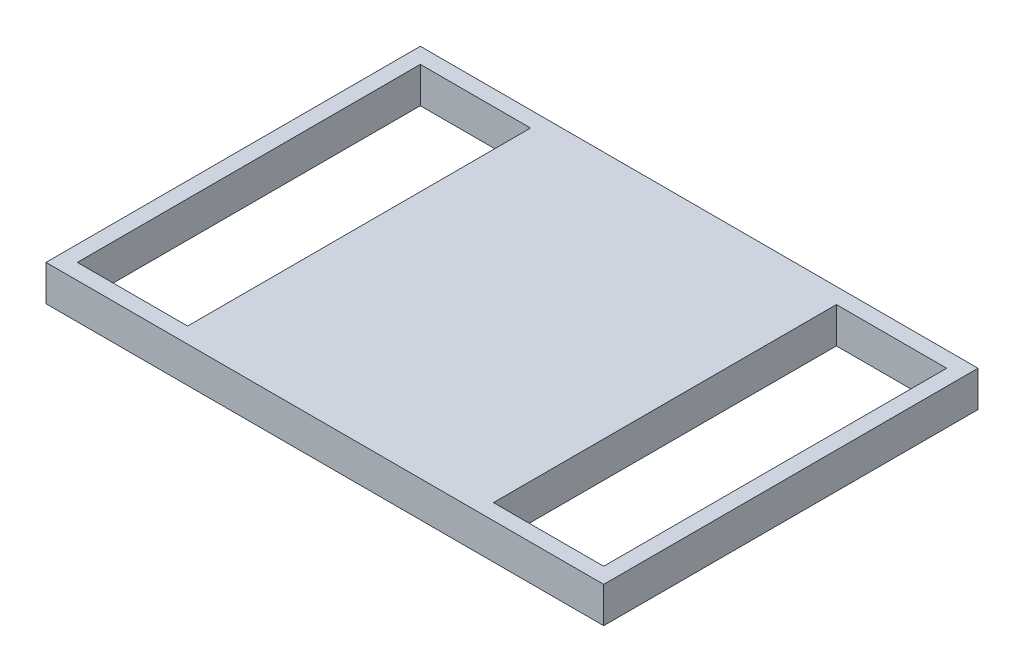
ISO-10303-21;
HEADER;
FILE_DESCRIPTION(('STEP AP214'),'2;1');
FILE_NAME('part.step','',(''),(''),'','','');
FILE_SCHEMA(('AUTOMOTIVE_DESIGN { 1 0 10303 214 1 1 1 1 }'));
ENDSEC;
DATA;
#1=APPLICATION_CONTEXT('core data for automotive mechanical design processes');
#2=APPLICATION_PROTOCOL_DEFINITION('international standard','automotive_design',2000,#1);
#3=PRODUCT_CONTEXT('',#1,'mechanical');
#4=PRODUCT('Part','Part','',(#3));
#5=PRODUCT_RELATED_PRODUCT_CATEGORY('part','',(#4));
#6=PRODUCT_DEFINITION_FORMATION('','',#4);
#7=PRODUCT_DEFINITION_CONTEXT('part definition',#1,'design');
#8=PRODUCT_DEFINITION('design','',#6,#7);
#9=PRODUCT_DEFINITION_SHAPE('','',#8);
#10=(LENGTH_UNIT() NAMED_UNIT(*) SI_UNIT(.MILLI.,.METRE.));
#11=(NAMED_UNIT(*) PLANE_ANGLE_UNIT() SI_UNIT($,.RADIAN.));
#12=(NAMED_UNIT(*) SI_UNIT($,.STERADIAN.) SOLID_ANGLE_UNIT());
#13=UNCERTAINTY_MEASURE_WITH_UNIT(LENGTH_MEASURE(1.E-05),#10,'distance_accuracy_value','');
#14=(GEOMETRIC_REPRESENTATION_CONTEXT(3) GLOBAL_UNCERTAINTY_ASSIGNED_CONTEXT((#13)) GLOBAL_UNIT_ASSIGNED_CONTEXT((#10,
#11,#12)) REPRESENTATION_CONTEXT('',''));
#15=CARTESIAN_POINT('',(0.,0.,0.));
#16=DIRECTION('',(0.,0.,1.));
#17=DIRECTION('',(1.,0.,0.));
#18=AXIS2_PLACEMENT_3D('',#15,#16,#17);
#19=CARTESIAN_POINT('',(0.,25.4,0.));
#20=DIRECTION('',(0.,1.,0.));
#21=DIRECTION('',(0.,0.,1.));
#22=AXIS2_PLACEMENT_3D('',#19,#20,#21);
#23=PLANE('',#22);
#24=DIRECTION('',(0.,0.,-1.));
#25=VECTOR('',#24,1.);
#26=CARTESIAN_POINT('',(197.7,25.4,132.7));
#27=LINE('',#26,#25);
#28=CARTESIAN_POINT('',(197.7,25.4,132.7));
#29=VERTEX_POINT('',#28);
#30=CARTESIAN_POINT('',(197.7,25.4,-132.7));
#31=VERTEX_POINT('',#30);
#32=EDGE_CURVE('E221',#29,#31,#27,.T.);
#33=ORIENTED_EDGE('',*,*,#32,.T.);
#34=DIRECTION('',(-1.,0.,0.));
#35=VECTOR('',#34,1.);
#36=CARTESIAN_POINT('',(197.7,25.4,-132.7));
#37=LINE('',#36,#35);
#38=CARTESIAN_POINT('',(-197.7,25.4,-132.7));
#39=VERTEX_POINT('',#38);
#40=EDGE_CURVE('E225',#31,#39,#37,.T.);
#41=ORIENTED_EDGE('',*,*,#40,.T.);
#42=DIRECTION('',(0.,0.,1.));
#43=VECTOR('',#42,1.);
#44=CARTESIAN_POINT('',(-197.7,25.4,132.7));
#45=LINE('',#44,#43);
#46=CARTESIAN_POINT('',(-197.7,25.4,132.7));
#47=VERTEX_POINT('',#46);
#48=EDGE_CURVE('E229',#39,#47,#45,.T.);
#49=ORIENTED_EDGE('',*,*,#48,.T.);
#50=DIRECTION('',(1.,0.,0.));
#51=VECTOR('',#50,1.);
#52=CARTESIAN_POINT('',(197.7,25.4,132.7));
#53=LINE('',#52,#51);
#54=EDGE_CURVE('E232',#47,#29,#53,.T.);
#55=ORIENTED_EDGE('',*,*,#54,.T.);
#56=EDGE_LOOP('',(#33,#41,#49,#55));
#57=FACE_BOUND('',#56,.T.);
#58=DIRECTION('',(0.,0.,1.));
#59=VECTOR('',#58,1.);
#60=CARTESIAN_POINT('',(-186.5875,25.4,0.));
#61=LINE('',#60,#59);
#62=CARTESIAN_POINT('',(-186.5875,25.4,-121.5875));
#63=VERTEX_POINT('',#62);
#64=CARTESIAN_POINT('',(-186.5875,25.4,121.5875));
#65=VERTEX_POINT('',#64);
#66=EDGE_CURVE('E200',#63,#65,#61,.T.);
#67=ORIENTED_EDGE('',*,*,#66,.F.);
#68=DIRECTION('',(1.,0.,0.));
#69=VECTOR('',#68,1.);
#70=CARTESIAN_POINT('',(0.,25.4,-121.5875));
#71=LINE('',#70,#69);
#72=CARTESIAN_POINT('',(-108.4125,25.4,-121.5875));
#73=VERTEX_POINT('',#72);
#74=EDGE_CURVE('E63',#63,#73,#71,.T.);
#75=ORIENTED_EDGE('',*,*,#74,.T.);
#76=DIRECTION('',(0.,0.,1.));
#77=VECTOR('',#76,1.);
#78=CARTESIAN_POINT('',(-108.4125,25.4,0.));
#79=LINE('',#78,#77);
#80=CARTESIAN_POINT('',(-108.4125,25.4,121.5875));
#81=VERTEX_POINT('',#80);
#82=EDGE_CURVE('E186',#73,#81,#79,.T.);
#83=ORIENTED_EDGE('',*,*,#82,.T.);
#84=DIRECTION('',(1.,0.,0.));
#85=VECTOR('',#84,1.);
#86=CARTESIAN_POINT('',(0.,25.4,121.5875));
#87=LINE('',#86,#85);
#88=EDGE_CURVE('E204',#65,#81,#87,.T.);
#89=ORIENTED_EDGE('',*,*,#88,.F.);
#90=EDGE_LOOP('',(#67,#75,#83,#89));
#91=FACE_BOUND('',#90,.T.);
#92=DIRECTION('',(0.,0.,1.));
#93=VECTOR('',#92,1.);
#94=CARTESIAN_POINT('',(108.4125,25.4,0.));
#95=LINE('',#94,#93);
#96=CARTESIAN_POINT('',(108.4125,25.4,-121.5875));
#97=VERTEX_POINT('',#96);
#98=CARTESIAN_POINT('',(108.4125,25.4,121.5875));
#99=VERTEX_POINT('',#98);
#100=EDGE_CURVE('E166',#97,#99,#95,.T.);
#101=ORIENTED_EDGE('',*,*,#100,.F.);
#102=DIRECTION('',(1.,0.,0.));
#103=VECTOR('',#102,1.);
#104=CARTESIAN_POINT('',(0.,25.4,-121.5875));
#105=LINE('',#104,#103);
#106=CARTESIAN_POINT('',(186.5875,25.4,-121.5875));
#107=VERTEX_POINT('',#106);
#108=EDGE_CURVE('E55',#97,#107,#105,.T.);
#109=ORIENTED_EDGE('',*,*,#108,.T.);
#110=DIRECTION('',(0.,0.,1.));
#111=VECTOR('',#110,1.);
#112=CARTESIAN_POINT('',(186.5875,25.4,0.));
#113=LINE('',#112,#111);
#114=CARTESIAN_POINT('',(186.5875,25.4,121.5875));
#115=VERTEX_POINT('',#114);
#116=EDGE_CURVE('E153',#107,#115,#113,.T.);
#117=ORIENTED_EDGE('',*,*,#116,.T.);
#118=DIRECTION('',(1.,0.,0.));
#119=VECTOR('',#118,1.);
#120=CARTESIAN_POINT('',(0.,25.4,121.5875));
#121=LINE('',#120,#119);
#122=EDGE_CURVE('E157',#99,#115,#121,.T.);
#123=ORIENTED_EDGE('',*,*,#122,.F.);
#124=EDGE_LOOP('',(#101,#109,#117,#123));
#125=FACE_BOUND('',#124,.T.);
#126=ADVANCED_FACE('F39',(#57,#91,#125),#23,.T.);
#127=CARTESIAN_POINT('',(0.,0.,0.));
#128=DIRECTION('',(0.,1.,0.));
#129=DIRECTION('',(0.,0.,1.));
#130=AXIS2_PLACEMENT_3D('',#127,#128,#129);
#131=PLANE('',#130);
#132=DIRECTION('',(1.,0.,0.));
#133=VECTOR('',#132,1.);
#134=CARTESIAN_POINT('',(0.,0.,-121.5875));
#135=LINE('',#134,#133);
#136=CARTESIAN_POINT('',(-186.5875,0.,-121.5875));
#137=VERTEX_POINT('',#136);
#138=CARTESIAN_POINT('',(-108.4125,0.,-121.5875));
#139=VERTEX_POINT('',#138);
#140=EDGE_CURVE('E182',#137,#139,#135,.T.);
#141=ORIENTED_EDGE('',*,*,#140,.F.);
#142=DIRECTION('',(0.,0.,1.));
#143=VECTOR('',#142,1.);
#144=CARTESIAN_POINT('',(-186.5875,0.,0.));
#145=LINE('',#144,#143);
#146=CARTESIAN_POINT('',(-186.5875,0.,121.5875));
#147=VERTEX_POINT('',#146);
#148=EDGE_CURVE('E185',#137,#147,#145,.T.);
#149=ORIENTED_EDGE('',*,*,#148,.T.);
#150=DIRECTION('',(1.,0.,0.));
#151=VECTOR('',#150,1.);
#152=CARTESIAN_POINT('',(0.,0.,121.5875));
#153=LINE('',#152,#151);
#154=CARTESIAN_POINT('',(-108.4125,0.,121.5875));
#155=VERTEX_POINT('',#154);
#156=EDGE_CURVE('E190',#147,#155,#153,.T.);
#157=ORIENTED_EDGE('',*,*,#156,.T.);
#158=DIRECTION('',(0.,0.,1.));
#159=VECTOR('',#158,1.);
#160=CARTESIAN_POINT('',(-108.4125,0.,0.));
#161=LINE('',#160,#159);
#162=EDGE_CURVE('E194',#139,#155,#161,.T.);
#163=ORIENTED_EDGE('',*,*,#162,.F.);
#164=EDGE_LOOP('',(#141,#149,#157,#163));
#165=FACE_BOUND('',#164,.T.);
#166=DIRECTION('',(0.,0.,-1.));
#167=VECTOR('',#166,1.);
#168=CARTESIAN_POINT('',(197.7,0.,132.7));
#169=LINE('',#168,#167);
#170=CARTESIAN_POINT('',(197.7,0.,132.7));
#171=VERTEX_POINT('',#170);
#172=CARTESIAN_POINT('',(197.7,0.,-132.7));
#173=VERTEX_POINT('',#172);
#174=EDGE_CURVE('E176',#171,#173,#169,.T.);
#175=ORIENTED_EDGE('',*,*,#174,.F.);
#176=DIRECTION('',(1.,0.,0.));
#177=VECTOR('',#176,1.);
#178=CARTESIAN_POINT('',(197.7,0.,132.7));
#179=LINE('',#178,#177);
#180=CARTESIAN_POINT('',(-197.7,0.,132.7));
#181=VERTEX_POINT('',#180);
#182=EDGE_CURVE('E226',#181,#171,#179,.T.);
#183=ORIENTED_EDGE('',*,*,#182,.F.);
#184=DIRECTION('',(0.,0.,1.));
#185=VECTOR('',#184,1.);
#186=CARTESIAN_POINT('',(-197.7,0.,132.7));
#187=LINE('',#186,#185);
#188=CARTESIAN_POINT('',(-197.7,0.,-132.7));
#189=VERTEX_POINT('',#188);
#190=EDGE_CURVE('E242',#189,#181,#187,.T.);
#191=ORIENTED_EDGE('',*,*,#190,.F.);
#192=DIRECTION('',(-1.,0.,0.));
#193=VECTOR('',#192,1.);
#194=CARTESIAN_POINT('',(197.7,0.,-132.7));
#195=LINE('',#194,#193);
#196=EDGE_CURVE('E239',#173,#189,#195,.T.);
#197=ORIENTED_EDGE('',*,*,#196,.F.);
#198=EDGE_LOOP('',(#175,#183,#191,#197));
#199=FACE_BOUND('',#198,.T.);
#200=DIRECTION('',(1.,0.,0.));
#201=VECTOR('',#200,1.);
#202=CARTESIAN_POINT('',(0.,0.,-121.5875));
#203=LINE('',#202,#201);
#204=CARTESIAN_POINT('',(108.4125,0.,-121.5875));
#205=VERTEX_POINT('',#204);
#206=CARTESIAN_POINT('',(186.5875,0.,-121.5875));
#207=VERTEX_POINT('',#206);
#208=EDGE_CURVE('E132',#205,#207,#203,.T.);
#209=ORIENTED_EDGE('',*,*,#208,.F.);
#210=DIRECTION('',(0.,0.,1.));
#211=VECTOR('',#210,1.);
#212=CARTESIAN_POINT('',(108.4125,0.,0.));
#213=LINE('',#212,#211);
#214=CARTESIAN_POINT('',(108.4125,0.,121.5875));
#215=VERTEX_POINT('',#214);
#216=EDGE_CURVE('E143',#205,#215,#213,.T.);
#217=ORIENTED_EDGE('',*,*,#216,.T.);
#218=DIRECTION('',(1.,0.,0.));
#219=VECTOR('',#218,1.);
#220=CARTESIAN_POINT('',(0.,0.,121.5875));
#221=LINE('',#220,#219);
#222=CARTESIAN_POINT('',(186.5875,0.,121.5875));
#223=VERTEX_POINT('',#222);
#224=EDGE_CURVE('E148',#215,#223,#221,.T.);
#225=ORIENTED_EDGE('',*,*,#224,.T.);
#226=DIRECTION('',(0.,0.,1.));
#227=VECTOR('',#226,1.);
#228=CARTESIAN_POINT('',(186.5875,0.,0.));
#229=LINE('',#228,#227);
#230=EDGE_CURVE('E139',#207,#223,#229,.T.);
#231=ORIENTED_EDGE('',*,*,#230,.F.);
#232=EDGE_LOOP('',(#209,#217,#225,#231));
#233=FACE_BOUND('',#232,.T.);
#234=ADVANCED_FACE('F151',(#165,#199,#233),#131,.F.);
#235=CARTESIAN_POINT('',(197.7,25.4,132.7));
#236=DIRECTION('',(-1.,0.,0.));
#237=DIRECTION('',(0.,0.,1.));
#238=AXIS2_PLACEMENT_3D('',#235,#236,#237);
#239=PLANE('',#238);
#240=ORIENTED_EDGE('',*,*,#174,.T.);
#241=DIRECTION('',(0.,-1.,0.));
#242=VECTOR('',#241,1.);
#243=CARTESIAN_POINT('',(197.7,25.4,-132.7));
#244=LINE('',#243,#242);
#245=EDGE_CURVE('E11',#31,#173,#244,.T.);
#246=ORIENTED_EDGE('',*,*,#245,.F.);
#247=ORIENTED_EDGE('',*,*,#32,.F.);
#248=DIRECTION('',(0.,-1.,0.));
#249=VECTOR('',#248,1.);
#250=CARTESIAN_POINT('',(197.7,25.4,132.7));
#251=LINE('',#250,#249);
#252=EDGE_CURVE('E235',#29,#171,#251,.T.);
#253=ORIENTED_EDGE('',*,*,#252,.T.);
#254=EDGE_LOOP('',(#240,#246,#247,#253));
#255=FACE_BOUND('',#254,.T.);
#256=ADVANCED_FACE('F41',(#255),#239,.F.);
#257=CARTESIAN_POINT('',(197.7,25.4,-132.7));
#258=DIRECTION('',(0.,0.,1.));
#259=DIRECTION('',(1.,0.,0.));
#260=AXIS2_PLACEMENT_3D('',#257,#258,#259);
#261=PLANE('',#260);
#262=ORIENTED_EDGE('',*,*,#196,.T.);
#263=DIRECTION('',(0.,-1.,0.));
#264=VECTOR('',#263,1.);
#265=CARTESIAN_POINT('',(-197.7,25.4,-132.7));
#266=LINE('',#265,#264);
#267=EDGE_CURVE('E48',#39,#189,#266,.T.);
#268=ORIENTED_EDGE('',*,*,#267,.F.);
#269=ORIENTED_EDGE('',*,*,#40,.F.);
#270=ORIENTED_EDGE('',*,*,#245,.T.);
#271=EDGE_LOOP('',(#262,#268,#269,#270));
#272=FACE_BOUND('',#271,.T.);
#273=ADVANCED_FACE('F274',(#272),#261,.F.);
#274=CARTESIAN_POINT('',(-197.7,25.4,132.7));
#275=DIRECTION('',(1.,0.,0.));
#276=DIRECTION('',(0.,0.,-1.));
#277=AXIS2_PLACEMENT_3D('',#274,#275,#276);
#278=PLANE('',#277);
#279=ORIENTED_EDGE('',*,*,#190,.T.);
#280=DIRECTION('',(0.,-1.,0.));
#281=VECTOR('',#280,1.);
#282=CARTESIAN_POINT('',(-197.7,25.4,132.7));
#283=LINE('',#282,#281);
#284=EDGE_CURVE('E250',#47,#181,#283,.T.);
#285=ORIENTED_EDGE('',*,*,#284,.F.);
#286=ORIENTED_EDGE('',*,*,#48,.F.);
#287=ORIENTED_EDGE('',*,*,#267,.T.);
#288=EDGE_LOOP('',(#279,#285,#286,#287));
#289=FACE_BOUND('',#288,.T.);
#290=ADVANCED_FACE('F259',(#289),#278,.F.);
#291=CARTESIAN_POINT('',(197.7,25.4,132.7));
#292=DIRECTION('',(0.,0.,-1.));
#293=DIRECTION('',(-1.,0.,0.));
#294=AXIS2_PLACEMENT_3D('',#291,#292,#293);
#295=PLANE('',#294);
#296=ORIENTED_EDGE('',*,*,#182,.T.);
#297=ORIENTED_EDGE('',*,*,#252,.F.);
#298=ORIENTED_EDGE('',*,*,#54,.F.);
#299=ORIENTED_EDGE('',*,*,#284,.T.);
#300=EDGE_LOOP('',(#296,#297,#298,#299));
#301=FACE_BOUND('',#300,.T.);
#302=ADVANCED_FACE('F267',(#301),#295,.F.);
#303=CARTESIAN_POINT('',(0.,0.,-121.5875));
#304=DIRECTION('',(0.,0.,1.));
#305=DIRECTION('',(1.,0.,0.));
#306=AXIS2_PLACEMENT_3D('',#303,#304,#305);
#307=PLANE('',#306);
#308=ORIENTED_EDGE('',*,*,#74,.F.);
#309=DIRECTION('',(0.,1.,0.));
#310=VECTOR('',#309,1.);
#311=CARTESIAN_POINT('',(-186.5875,0.,-121.5875));
#312=LINE('',#311,#310);
#313=EDGE_CURVE('E197',#137,#63,#312,.T.);
#314=ORIENTED_EDGE('',*,*,#313,.F.);
#315=ORIENTED_EDGE('',*,*,#140,.T.);
#316=DIRECTION('',(0.,1.,0.));
#317=VECTOR('',#316,1.);
#318=CARTESIAN_POINT('',(-108.4125,0.,-121.5875));
#319=LINE('',#318,#317);
#320=EDGE_CURVE('E167',#139,#73,#319,.T.);
#321=ORIENTED_EDGE('',*,*,#320,.T.);
#322=EDGE_LOOP('',(#308,#314,#315,#321));
#323=FACE_BOUND('',#322,.T.);
#324=ADVANCED_FACE('F289',(#323),#307,.T.);
#325=CARTESIAN_POINT('',(-108.4125,0.,0.));
#326=DIRECTION('',(-1.,0.,0.));
#327=DIRECTION('',(0.,0.,1.));
#328=AXIS2_PLACEMENT_3D('',#325,#326,#327);
#329=PLANE('',#328);
#330=ORIENTED_EDGE('',*,*,#82,.F.);
#331=ORIENTED_EDGE('',*,*,#320,.F.);
#332=ORIENTED_EDGE('',*,*,#162,.T.);
#333=DIRECTION('',(0.,1.,0.));
#334=VECTOR('',#333,1.);
#335=CARTESIAN_POINT('',(-108.4125,0.,121.5875));
#336=LINE('',#335,#334);
#337=EDGE_CURVE('E213',#155,#81,#336,.T.);
#338=ORIENTED_EDGE('',*,*,#337,.T.);
#339=EDGE_LOOP('',(#330,#331,#332,#338));
#340=FACE_BOUND('',#339,.T.);
#341=ADVANCED_FACE('F296',(#340),#329,.T.);
#342=CARTESIAN_POINT('',(0.,0.,121.5875));
#343=DIRECTION('',(0.,0.,1.));
#344=DIRECTION('',(1.,0.,0.));
#345=AXIS2_PLACEMENT_3D('',#342,#343,#344);
#346=PLANE('',#345);
#347=ORIENTED_EDGE('',*,*,#88,.T.);
#348=ORIENTED_EDGE('',*,*,#337,.F.);
#349=ORIENTED_EDGE('',*,*,#156,.F.);
#350=DIRECTION('',(0.,1.,0.));
#351=VECTOR('',#350,1.);
#352=CARTESIAN_POINT('',(-186.5875,0.,121.5875));
#353=LINE('',#352,#351);
#354=EDGE_CURVE('E216',#147,#65,#353,.T.);
#355=ORIENTED_EDGE('',*,*,#354,.T.);
#356=EDGE_LOOP('',(#347,#348,#349,#355));
#357=FACE_BOUND('',#356,.T.);
#358=ADVANCED_FACE('F300',(#357),#346,.F.);
#359=CARTESIAN_POINT('',(-186.5875,0.,0.));
#360=DIRECTION('',(-1.,0.,0.));
#361=DIRECTION('',(0.,0.,1.));
#362=AXIS2_PLACEMENT_3D('',#359,#360,#361);
#363=PLANE('',#362);
#364=ORIENTED_EDGE('',*,*,#66,.T.);
#365=ORIENTED_EDGE('',*,*,#354,.F.);
#366=ORIENTED_EDGE('',*,*,#148,.F.);
#367=ORIENTED_EDGE('',*,*,#313,.T.);
#368=EDGE_LOOP('',(#364,#365,#366,#367));
#369=FACE_BOUND('',#368,.T.);
#370=ADVANCED_FACE('F306',(#369),#363,.F.);
#371=CARTESIAN_POINT('',(0.,0.,-121.5875));
#372=DIRECTION('',(0.,0.,1.));
#373=DIRECTION('',(1.,0.,0.));
#374=AXIS2_PLACEMENT_3D('',#371,#372,#373);
#375=PLANE('',#374);
#376=ORIENTED_EDGE('',*,*,#108,.F.);
#377=DIRECTION('',(0.,1.,0.));
#378=VECTOR('',#377,1.);
#379=CARTESIAN_POINT('',(108.4125,0.,-121.5875));
#380=LINE('',#379,#378);
#381=EDGE_CURVE('E128',#205,#97,#380,.T.);
#382=ORIENTED_EDGE('',*,*,#381,.F.);
#383=ORIENTED_EDGE('',*,*,#208,.T.);
#384=DIRECTION('',(0.,1.,0.));
#385=VECTOR('',#384,1.);
#386=CARTESIAN_POINT('',(186.5875,0.,-121.5875));
#387=LINE('',#386,#385);
#388=EDGE_CURVE('E173',#207,#107,#387,.T.);
#389=ORIENTED_EDGE('',*,*,#388,.T.);
#390=EDGE_LOOP('',(#376,#382,#383,#389));
#391=FACE_BOUND('',#390,.T.);
#392=ADVANCED_FACE('F130',(#391),#375,.T.);
#393=CARTESIAN_POINT('',(186.5875,0.,0.));
#394=DIRECTION('',(-1.,0.,0.));
#395=DIRECTION('',(0.,0.,1.));
#396=AXIS2_PLACEMENT_3D('',#393,#394,#395);
#397=PLANE('',#396);
#398=ORIENTED_EDGE('',*,*,#116,.F.);
#399=ORIENTED_EDGE('',*,*,#388,.F.);
#400=ORIENTED_EDGE('',*,*,#230,.T.);
#401=DIRECTION('',(0.,1.,0.));
#402=VECTOR('',#401,1.);
#403=CARTESIAN_POINT('',(186.5875,0.,121.5875));
#404=LINE('',#403,#402);
#405=EDGE_CURVE('E177',#223,#115,#404,.T.);
#406=ORIENTED_EDGE('',*,*,#405,.T.);
#407=EDGE_LOOP('',(#398,#399,#400,#406));
#408=FACE_BOUND('',#407,.T.);
#409=ADVANCED_FACE('F316',(#408),#397,.T.);
#410=CARTESIAN_POINT('',(0.,0.,121.5875));
#411=DIRECTION('',(0.,0.,1.));
#412=DIRECTION('',(1.,0.,0.));
#413=AXIS2_PLACEMENT_3D('',#410,#411,#412);
#414=PLANE('',#413);
#415=ORIENTED_EDGE('',*,*,#122,.T.);
#416=ORIENTED_EDGE('',*,*,#405,.F.);
#417=ORIENTED_EDGE('',*,*,#224,.F.);
#418=DIRECTION('',(0.,1.,0.));
#419=VECTOR('',#418,1.);
#420=CARTESIAN_POINT('',(108.4125,0.,121.5875));
#421=LINE('',#420,#419);
#422=EDGE_CURVE('E138',#215,#99,#421,.T.);
#423=ORIENTED_EDGE('',*,*,#422,.T.);
#424=EDGE_LOOP('',(#415,#416,#417,#423));
#425=FACE_BOUND('',#424,.T.);
#426=ADVANCED_FACE('F329',(#425),#414,.F.);
#427=CARTESIAN_POINT('',(108.4125,0.,0.));
#428=DIRECTION('',(-1.,0.,0.));
#429=DIRECTION('',(0.,0.,1.));
#430=AXIS2_PLACEMENT_3D('',#427,#428,#429);
#431=PLANE('',#430);
#432=ORIENTED_EDGE('',*,*,#100,.T.);
#433=ORIENTED_EDGE('',*,*,#422,.F.);
#434=ORIENTED_EDGE('',*,*,#216,.F.);
#435=ORIENTED_EDGE('',*,*,#381,.T.);
#436=EDGE_LOOP('',(#432,#433,#434,#435));
#437=FACE_BOUND('',#436,.T.);
#438=ADVANCED_FACE('F144',(#437),#431,.F.);
#439=CLOSED_SHELL('',(#126,#234,#256,#273,#290,#302,#324,#341,#358,#370,#392,#409,#426,#438));
#440=MANIFOLD_SOLID_BREP('B2',#439);
#441=ADVANCED_BREP_SHAPE_REPRESENTATION('',(#18,#440),#14);
#442=SHAPE_DEFINITION_REPRESENTATION(#9,#441);
ENDSEC;
END-ISO-10303-21;
